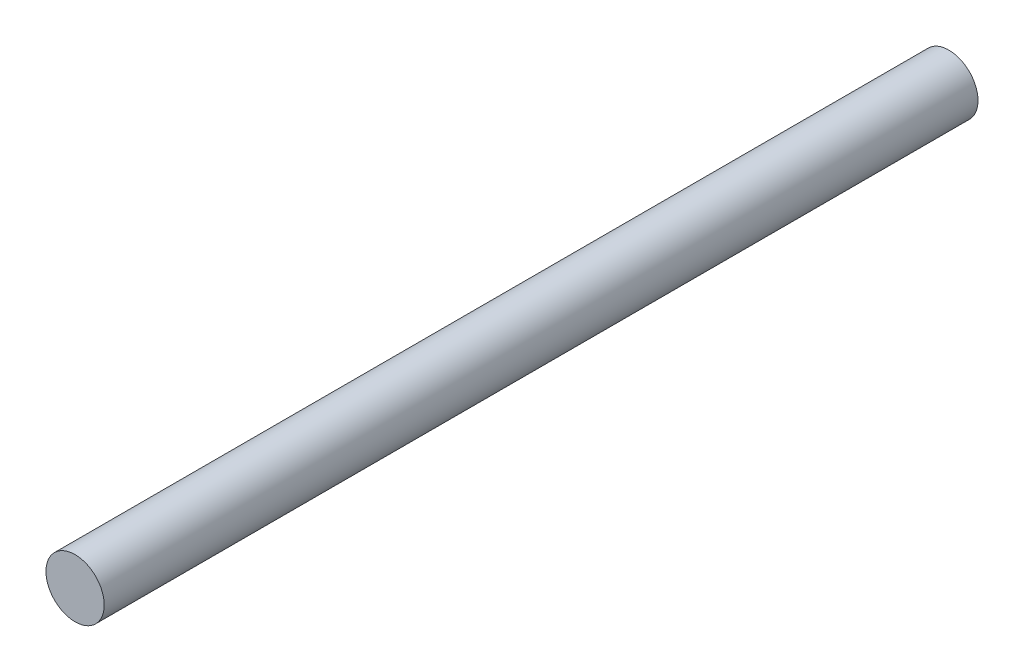
ISO-10303-21;
HEADER;
FILE_DESCRIPTION(('STEP AP214'),'2;1');
FILE_NAME('part.step','',(''),(''),'','','');
FILE_SCHEMA(('AUTOMOTIVE_DESIGN { 1 0 10303 214 1 1 1 1 }'));
ENDSEC;
DATA;
#1=APPLICATION_CONTEXT('core data for automotive mechanical design processes');
#2=APPLICATION_PROTOCOL_DEFINITION('international standard','automotive_design',2000,#1);
#3=PRODUCT_CONTEXT('',#1,'mechanical');
#4=PRODUCT('Part','Part','',(#3));
#5=PRODUCT_RELATED_PRODUCT_CATEGORY('part','',(#4));
#6=PRODUCT_DEFINITION_FORMATION('','',#4);
#7=PRODUCT_DEFINITION_CONTEXT('part definition',#1,'design');
#8=PRODUCT_DEFINITION('design','',#6,#7);
#9=PRODUCT_DEFINITION_SHAPE('','',#8);
#10=(LENGTH_UNIT() NAMED_UNIT(*) SI_UNIT(.MILLI.,.METRE.));
#11=(NAMED_UNIT(*) PLANE_ANGLE_UNIT() SI_UNIT($,.RADIAN.));
#12=(NAMED_UNIT(*) SI_UNIT($,.STERADIAN.) SOLID_ANGLE_UNIT());
#13=UNCERTAINTY_MEASURE_WITH_UNIT(LENGTH_MEASURE(1.E-05),#10,'distance_accuracy_value','');
#14=(GEOMETRIC_REPRESENTATION_CONTEXT(3) GLOBAL_UNCERTAINTY_ASSIGNED_CONTEXT((#13)) GLOBAL_UNIT_ASSIGNED_CONTEXT((#10,
#11,#12)) REPRESENTATION_CONTEXT('',''));
#15=CARTESIAN_POINT('',(0.,0.,0.));
#16=DIRECTION('',(0.,0.,1.));
#17=DIRECTION('',(1.,0.,0.));
#18=AXIS2_PLACEMENT_3D('',#15,#16,#17);
#19=CARTESIAN_POINT('',(0.,0.,120.));
#20=DIRECTION('',(0.,0.,-1.));
#21=DIRECTION('',(-1.,0.,0.));
#22=AXIS2_PLACEMENT_3D('',#19,#20,#21);
#23=CYLINDRICAL_SURFACE('',#22,4.);
#24=CARTESIAN_POINT('',(0.,0.,120.));
#25=DIRECTION('',(0.,0.,1.));
#26=DIRECTION('',(1.,0.,0.));
#27=AXIS2_PLACEMENT_3D('',#24,#25,#26);
#28=CIRCLE('',#27,4.);
#29=CARTESIAN_POINT('',(4.,0.,120.));
#30=VERTEX_POINT('',#29);
#31=EDGE_CURVE('E10',#30,#30,#28,.T.);
#32=ORIENTED_EDGE('',*,*,#31,.F.);
#33=EDGE_LOOP('',(#32));
#34=FACE_BOUND('',#33,.T.);
#35=CARTESIAN_POINT('',(0.,0.,0.));
#36=DIRECTION('',(0.,0.,1.));
#37=DIRECTION('',(1.,0.,0.));
#38=AXIS2_PLACEMENT_3D('',#35,#36,#37);
#39=CIRCLE('',#38,4.);
#40=CARTESIAN_POINT('',(4.,0.,0.));
#41=VERTEX_POINT('',#40);
#42=EDGE_CURVE('E40',#41,#41,#39,.T.);
#43=ORIENTED_EDGE('',*,*,#42,.T.);
#44=EDGE_LOOP('',(#43));
#45=FACE_BOUND('',#44,.T.);
#46=ADVANCED_FACE('F37',(#34,#45),#23,.T.);
#47=CARTESIAN_POINT('',(0.,0.,120.));
#48=DIRECTION('',(0.,0.,1.));
#49=DIRECTION('',(1.,0.,0.));
#50=AXIS2_PLACEMENT_3D('',#47,#48,#49);
#51=PLANE('',#50);
#52=ORIENTED_EDGE('',*,*,#31,.T.);
#53=EDGE_LOOP('',(#52));
#54=FACE_BOUND('',#53,.T.);
#55=ADVANCED_FACE('F54',(#54),#51,.T.);
#56=CARTESIAN_POINT('',(0.,0.,0.));
#57=DIRECTION('',(0.,0.,1.));
#58=DIRECTION('',(1.,0.,0.));
#59=AXIS2_PLACEMENT_3D('',#56,#57,#58);
#60=PLANE('',#59);
#61=ORIENTED_EDGE('',*,*,#42,.F.);
#62=EDGE_LOOP('',(#61));
#63=FACE_BOUND('',#62,.T.);
#64=ADVANCED_FACE('F52',(#63),#60,.F.);
#65=CLOSED_SHELL('',(#46,#55,#64));
#66=MANIFOLD_SOLID_BREP('B2',#65);
#67=ADVANCED_BREP_SHAPE_REPRESENTATION('',(#18,#66),#14);
#68=SHAPE_DEFINITION_REPRESENTATION(#9,#67);
ENDSEC;
END-ISO-10303-21;
